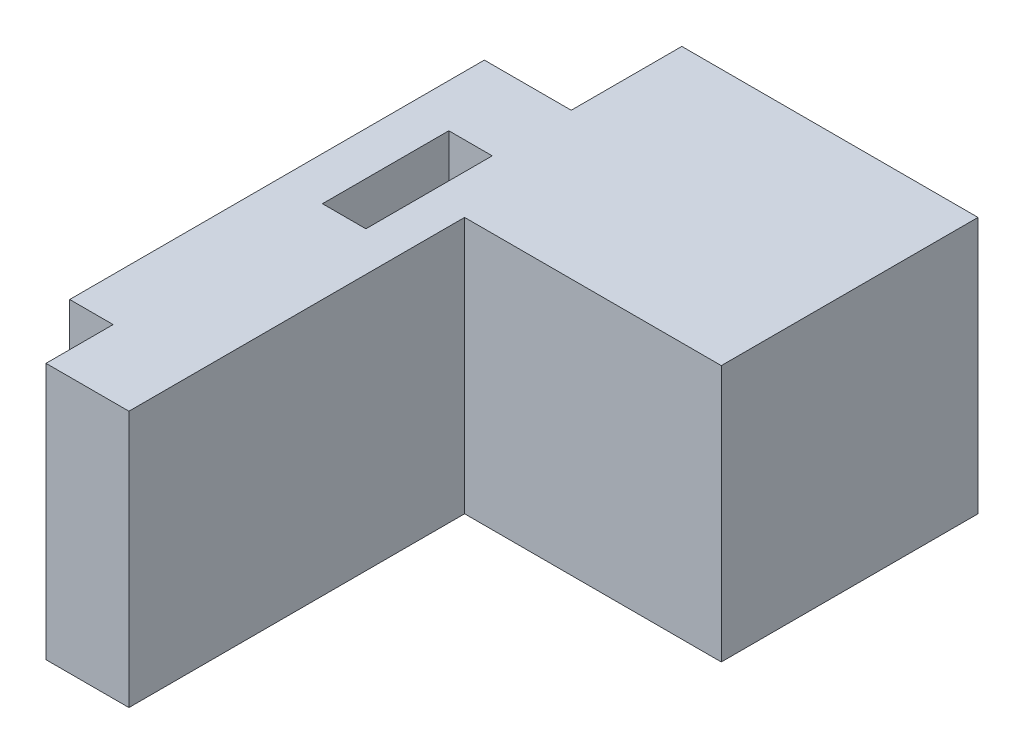
ISO-10303-21;
HEADER;
FILE_DESCRIPTION(('STEP AP214'),'2;1');
FILE_NAME('part.step','',(''),(''),'','','');
FILE_SCHEMA(('AUTOMOTIVE_DESIGN { 1 0 10303 214 1 1 1 1 }'));
ENDSEC;
DATA;
#1=APPLICATION_CONTEXT('core data for automotive mechanical design processes');
#2=APPLICATION_PROTOCOL_DEFINITION('international standard','automotive_design',2000,#1);
#3=PRODUCT_CONTEXT('',#1,'mechanical');
#4=PRODUCT('Part','Part','',(#3));
#5=PRODUCT_RELATED_PRODUCT_CATEGORY('part','',(#4));
#6=PRODUCT_DEFINITION_FORMATION('','',#4);
#7=PRODUCT_DEFINITION_CONTEXT('part definition',#1,'design');
#8=PRODUCT_DEFINITION('design','',#6,#7);
#9=PRODUCT_DEFINITION_SHAPE('','',#8);
#10=(LENGTH_UNIT() NAMED_UNIT(*) SI_UNIT(.MILLI.,.METRE.));
#11=(NAMED_UNIT(*) PLANE_ANGLE_UNIT() SI_UNIT($,.RADIAN.));
#12=(NAMED_UNIT(*) SI_UNIT($,.STERADIAN.) SOLID_ANGLE_UNIT());
#13=UNCERTAINTY_MEASURE_WITH_UNIT(LENGTH_MEASURE(1.E-05),#10,'distance_accuracy_value','');
#14=(GEOMETRIC_REPRESENTATION_CONTEXT(3) GLOBAL_UNCERTAINTY_ASSIGNED_CONTEXT((#13)) GLOBAL_UNIT_ASSIGNED_CONTEXT((#10,
#11,#12)) REPRESENTATION_CONTEXT('',''));
#15=CARTESIAN_POINT('',(0.,0.,0.));
#16=DIRECTION('',(0.,0.,1.));
#17=DIRECTION('',(1.,0.,0.));
#18=AXIS2_PLACEMENT_3D('',#15,#16,#17);
#19=CARTESIAN_POINT('',(0.,65.,32.5));
#20=DIRECTION('',(0.,0.,-1.));
#21=DIRECTION('',(-1.,0.,0.));
#22=AXIS2_PLACEMENT_3D('',#19,#20,#21);
#23=PLANE('',#22);
#24=DIRECTION('',(1.,0.,0.));
#25=VECTOR('',#24,1.);
#26=CARTESIAN_POINT('',(0.,0.,32.5));
#27=LINE('',#26,#25);
#28=CARTESIAN_POINT('',(-27.5,0.,32.5));
#29=VERTEX_POINT('',#28);
#30=CARTESIAN_POINT('',(37.5,0.,32.5));
#31=VERTEX_POINT('',#30);
#32=EDGE_CURVE('E193',#29,#31,#27,.T.);
#33=ORIENTED_EDGE('',*,*,#32,.T.);
#34=DIRECTION('',(0.,-1.,0.));
#35=VECTOR('',#34,1.);
#36=CARTESIAN_POINT('',(37.5,65.,32.5));
#37=LINE('',#36,#35);
#38=CARTESIAN_POINT('',(37.5,65.,32.5));
#39=VERTEX_POINT('',#38);
#40=EDGE_CURVE('E11',#39,#31,#37,.T.);
#41=ORIENTED_EDGE('',*,*,#40,.F.);
#42=DIRECTION('',(1.,0.,0.));
#43=VECTOR('',#42,1.);
#44=CARTESIAN_POINT('',(0.,65.,32.5));
#45=LINE('',#44,#43);
#46=CARTESIAN_POINT('',(-27.5,65.,32.5));
#47=VERTEX_POINT('',#46);
#48=EDGE_CURVE('E307',#47,#39,#45,.T.);
#49=ORIENTED_EDGE('',*,*,#48,.F.);
#50=DIRECTION('',(0.,-1.,0.));
#51=VECTOR('',#50,1.);
#52=CARTESIAN_POINT('',(-27.5,65.,32.5));
#53=LINE('',#52,#51);
#54=EDGE_CURVE('E60',#47,#29,#53,.T.);
#55=ORIENTED_EDGE('',*,*,#54,.T.);
#56=EDGE_LOOP('',(#33,#41,#49,#55));
#57=FACE_BOUND('',#56,.T.);
#58=ADVANCED_FACE('F41',(#57),#23,.F.);
#59=CARTESIAN_POINT('',(37.5,65.,0.));
#60=DIRECTION('',(-1.,0.,0.));
#61=DIRECTION('',(0.,0.,1.));
#62=AXIS2_PLACEMENT_3D('',#59,#60,#61);
#63=PLANE('',#62);
#64=DIRECTION('',(0.,0.,-1.));
#65=VECTOR('',#64,1.);
#66=CARTESIAN_POINT('',(37.5,0.,0.));
#67=LINE('',#66,#65);
#68=CARTESIAN_POINT('',(37.5,0.,-32.5));
#69=VERTEX_POINT('',#68);
#70=EDGE_CURVE('E196',#31,#69,#67,.T.);
#71=ORIENTED_EDGE('',*,*,#70,.T.);
#72=DIRECTION('',(0.,-1.,0.));
#73=VECTOR('',#72,1.);
#74=CARTESIAN_POINT('',(37.5,65.,-32.5));
#75=LINE('',#74,#73);
#76=CARTESIAN_POINT('',(37.5,65.,-32.5));
#77=VERTEX_POINT('',#76);
#78=EDGE_CURVE('E51',#77,#69,#75,.T.);
#79=ORIENTED_EDGE('',*,*,#78,.F.);
#80=DIRECTION('',(0.,0.,-1.));
#81=VECTOR('',#80,1.);
#82=CARTESIAN_POINT('',(37.5,65.,0.));
#83=LINE('',#82,#81);
#84=EDGE_CURVE('E310',#39,#77,#83,.T.);
#85=ORIENTED_EDGE('',*,*,#84,.F.);
#86=ORIENTED_EDGE('',*,*,#40,.T.);
#87=EDGE_LOOP('',(#71,#79,#85,#86));
#88=FACE_BOUND('',#87,.T.);
#89=ADVANCED_FACE('F264',(#88),#63,.F.);
#90=CARTESIAN_POINT('',(0.,65.,-32.5));
#91=DIRECTION('',(0.,0.,-1.));
#92=DIRECTION('',(-1.,0.,0.));
#93=AXIS2_PLACEMENT_3D('',#90,#91,#92);
#94=PLANE('',#93);
#95=DIRECTION('',(1.,0.,0.));
#96=VECTOR('',#95,1.);
#97=CARTESIAN_POINT('',(0.,0.,-32.5));
#98=LINE('',#97,#96);
#99=CARTESIAN_POINT('',(-37.5,0.,-32.5));
#100=VERTEX_POINT('',#99);
#101=EDGE_CURVE('E199',#100,#69,#98,.T.);
#102=ORIENTED_EDGE('',*,*,#101,.F.);
#103=DIRECTION('',(0.,-1.,0.));
#104=VECTOR('',#103,1.);
#105=CARTESIAN_POINT('',(-37.5,65.,-32.5));
#106=LINE('',#105,#104);
#107=CARTESIAN_POINT('',(-37.5,65.,-32.5));
#108=VERTEX_POINT('',#107);
#109=EDGE_CURVE('E227',#108,#100,#106,.T.);
#110=ORIENTED_EDGE('',*,*,#109,.F.);
#111=DIRECTION('',(1.,0.,0.));
#112=VECTOR('',#111,1.);
#113=CARTESIAN_POINT('',(0.,65.,-32.5));
#114=LINE('',#113,#112);
#115=EDGE_CURVE('E312',#108,#77,#114,.T.);
#116=ORIENTED_EDGE('',*,*,#115,.T.);
#117=ORIENTED_EDGE('',*,*,#78,.T.);
#118=EDGE_LOOP('',(#102,#110,#116,#117));
#119=FACE_BOUND('',#118,.T.);
#120=ADVANCED_FACE('F268',(#119),#94,.T.);
#121=CARTESIAN_POINT('',(-37.5,65.,0.));
#122=DIRECTION('',(-1.,0.,0.));
#123=DIRECTION('',(0.,0.,1.));
#124=AXIS2_PLACEMENT_3D('',#121,#122,#123);
#125=PLANE('',#124);
#126=DIRECTION('',(0.,0.,-1.));
#127=VECTOR('',#126,1.);
#128=CARTESIAN_POINT('',(-37.5,0.,0.));
#129=LINE('',#128,#127);
#130=CARTESIAN_POINT('',(-37.5,0.,-4.50000000000007));
#131=VERTEX_POINT('',#130);
#132=EDGE_CURVE('E194',#131,#100,#129,.T.);
#133=ORIENTED_EDGE('',*,*,#132,.F.);
#134=DIRECTION('',(0.,-1.,0.));
#135=VECTOR('',#134,1.);
#136=CARTESIAN_POINT('',(-37.5,65.,-4.50000000000007));
#137=LINE('',#136,#135);
#138=CARTESIAN_POINT('',(-37.5,65.,-4.50000000000007));
#139=VERTEX_POINT('',#138);
#140=EDGE_CURVE('E225',#139,#131,#137,.T.);
#141=ORIENTED_EDGE('',*,*,#140,.F.);
#142=DIRECTION('',(0.,0.,-1.));
#143=VECTOR('',#142,1.);
#144=CARTESIAN_POINT('',(-37.5,65.,0.));
#145=LINE('',#144,#143);
#146=EDGE_CURVE('E308',#139,#108,#145,.T.);
#147=ORIENTED_EDGE('',*,*,#146,.T.);
#148=ORIENTED_EDGE('',*,*,#109,.T.);
#149=EDGE_LOOP('',(#133,#141,#147,#148));
#150=FACE_BOUND('',#149,.T.);
#151=ADVANCED_FACE('F261',(#150),#125,.T.);
#152=CARTESIAN_POINT('',(0.,65.,-4.50000000000007));
#153=DIRECTION('',(0.,0.,-1.));
#154=DIRECTION('',(-1.,0.,0.));
#155=AXIS2_PLACEMENT_3D('',#152,#153,#154);
#156=PLANE('',#155);
#157=DIRECTION('',(1.,0.,0.));
#158=VECTOR('',#157,1.);
#159=CARTESIAN_POINT('',(0.,0.,-4.50000000000007));
#160=LINE('',#159,#158);
#161=CARTESIAN_POINT('',(-59.5,0.,-4.50000000000007));
#162=VERTEX_POINT('',#161);
#163=EDGE_CURVE('E202',#162,#131,#160,.T.);
#164=ORIENTED_EDGE('',*,*,#163,.F.);
#165=DIRECTION('',(0.,-1.,0.));
#166=VECTOR('',#165,1.);
#167=CARTESIAN_POINT('',(-59.5,65.,-4.50000000000007));
#168=LINE('',#167,#166);
#169=CARTESIAN_POINT('',(-59.5,65.,-4.50000000000007));
#170=VERTEX_POINT('',#169);
#171=EDGE_CURVE('E223',#170,#162,#168,.T.);
#172=ORIENTED_EDGE('',*,*,#171,.F.);
#173=DIRECTION('',(1.,0.,0.));
#174=VECTOR('',#173,1.);
#175=CARTESIAN_POINT('',(0.,65.,-4.50000000000007));
#176=LINE('',#175,#174);
#177=EDGE_CURVE('E315',#170,#139,#176,.T.);
#178=ORIENTED_EDGE('',*,*,#177,.T.);
#179=ORIENTED_EDGE('',*,*,#140,.T.);
#180=EDGE_LOOP('',(#164,#172,#178,#179));
#181=FACE_BOUND('',#180,.T.);
#182=ADVANCED_FACE('F276',(#181),#156,.T.);
#183=CARTESIAN_POINT('',(-59.5,65.,0.));
#184=DIRECTION('',(-1.,0.,0.));
#185=DIRECTION('',(0.,0.,1.));
#186=AXIS2_PLACEMENT_3D('',#183,#184,#185);
#187=PLANE('',#186);
#188=DIRECTION('',(0.,0.,-1.));
#189=VECTOR('',#188,1.);
#190=CARTESIAN_POINT('',(-59.5,0.,0.));
#191=LINE('',#190,#189);
#192=CARTESIAN_POINT('',(-59.5,0.,100.5));
#193=VERTEX_POINT('',#192);
#194=EDGE_CURVE('E205',#193,#162,#191,.T.);
#195=ORIENTED_EDGE('',*,*,#194,.F.);
#196=DIRECTION('',(0.,-1.,0.));
#197=VECTOR('',#196,1.);
#198=CARTESIAN_POINT('',(-59.5,65.,100.5));
#199=LINE('',#198,#197);
#200=CARTESIAN_POINT('',(-59.5,65.,100.5));
#201=VERTEX_POINT('',#200);
#202=EDGE_CURVE('E221',#201,#193,#199,.T.);
#203=ORIENTED_EDGE('',*,*,#202,.F.);
#204=DIRECTION('',(0.,0.,-1.));
#205=VECTOR('',#204,1.);
#206=CARTESIAN_POINT('',(-59.5,65.,0.));
#207=LINE('',#206,#205);
#208=EDGE_CURVE('E176',#201,#170,#207,.T.);
#209=ORIENTED_EDGE('',*,*,#208,.T.);
#210=ORIENTED_EDGE('',*,*,#171,.T.);
#211=EDGE_LOOP('',(#195,#203,#209,#210));
#212=FACE_BOUND('',#211,.T.);
#213=ADVANCED_FACE('F280',(#212),#187,.T.);
#214=CARTESIAN_POINT('',(0.,65.,100.5));
#215=DIRECTION('',(0.,0.,1.));
#216=DIRECTION('',(1.,0.,0.));
#217=AXIS2_PLACEMENT_3D('',#214,#215,#216);
#218=PLANE('',#217);
#219=DIRECTION('',(-1.,0.,0.));
#220=VECTOR('',#219,1.);
#221=CARTESIAN_POINT('',(0.,0.,100.5));
#222=LINE('',#221,#220);
#223=CARTESIAN_POINT('',(-48.5,0.,100.5));
#224=VERTEX_POINT('',#223);
#225=EDGE_CURVE('E208',#224,#193,#222,.T.);
#226=ORIENTED_EDGE('',*,*,#225,.F.);
#227=DIRECTION('',(0.,-1.,0.));
#228=VECTOR('',#227,1.);
#229=CARTESIAN_POINT('',(-48.5,65.,100.5));
#230=LINE('',#229,#228);
#231=CARTESIAN_POINT('',(-48.5,65.,100.5));
#232=VERTEX_POINT('',#231);
#233=EDGE_CURVE('E161',#232,#224,#230,.T.);
#234=ORIENTED_EDGE('',*,*,#233,.F.);
#235=DIRECTION('',(-1.,0.,0.));
#236=VECTOR('',#235,1.);
#237=CARTESIAN_POINT('',(0.,65.,100.5));
#238=LINE('',#237,#236);
#239=EDGE_CURVE('E174',#232,#201,#238,.T.);
#240=ORIENTED_EDGE('',*,*,#239,.T.);
#241=ORIENTED_EDGE('',*,*,#202,.T.);
#242=EDGE_LOOP('',(#226,#234,#240,#241));
#243=FACE_BOUND('',#242,.T.);
#244=ADVANCED_FACE('F284',(#243),#218,.T.);
#245=CARTESIAN_POINT('',(-48.5,65.,0.));
#246=DIRECTION('',(-1.,0.,0.));
#247=DIRECTION('',(0.,0.,1.));
#248=AXIS2_PLACEMENT_3D('',#245,#246,#247);
#249=PLANE('',#248);
#250=DIRECTION('',(0.,0.,-1.));
#251=VECTOR('',#250,1.);
#252=CARTESIAN_POINT('',(-48.5,0.,0.));
#253=LINE('',#252,#251);
#254=CARTESIAN_POINT('',(-48.5,0.,117.5));
#255=VERTEX_POINT('',#254);
#256=EDGE_CURVE('E158',#255,#224,#253,.T.);
#257=ORIENTED_EDGE('',*,*,#256,.F.);
#258=DIRECTION('',(0.,-1.,0.));
#259=VECTOR('',#258,1.);
#260=CARTESIAN_POINT('',(-48.5,65.,117.5));
#261=LINE('',#260,#259);
#262=CARTESIAN_POINT('',(-48.5,65.,117.5));
#263=VERTEX_POINT('',#262);
#264=EDGE_CURVE('E152',#263,#255,#261,.T.);
#265=ORIENTED_EDGE('',*,*,#264,.F.);
#266=DIRECTION('',(0.,0.,-1.));
#267=VECTOR('',#266,1.);
#268=CARTESIAN_POINT('',(-48.5,65.,0.));
#269=LINE('',#268,#267);
#270=EDGE_CURVE('E156',#263,#232,#269,.T.);
#271=ORIENTED_EDGE('',*,*,#270,.T.);
#272=ORIENTED_EDGE('',*,*,#233,.T.);
#273=EDGE_LOOP('',(#257,#265,#271,#272));
#274=FACE_BOUND('',#273,.T.);
#275=ADVANCED_FACE('F154',(#274),#249,.T.);
#276=CARTESIAN_POINT('',(-3.2612801348364E-13,65.,117.5));
#277=DIRECTION('',(0.,0.,-1.));
#278=DIRECTION('',(-1.,0.,0.));
#279=AXIS2_PLACEMENT_3D('',#276,#277,#278);
#280=PLANE('',#279);
#281=DIRECTION('',(1.,0.,0.));
#282=VECTOR('',#281,1.);
#283=CARTESIAN_POINT('',(-3.2612801348364E-13,0.,117.5));
#284=LINE('',#283,#282);
#285=CARTESIAN_POINT('',(-27.5,0.,117.5));
#286=VERTEX_POINT('',#285);
#287=EDGE_CURVE('E212',#255,#286,#284,.T.);
#288=ORIENTED_EDGE('',*,*,#287,.T.);
#289=DIRECTION('',(0.,-1.,0.));
#290=VECTOR('',#289,1.);
#291=CARTESIAN_POINT('',(-27.5,65.,117.5));
#292=LINE('',#291,#290);
#293=CARTESIAN_POINT('',(-27.5,65.,117.5));
#294=VERTEX_POINT('',#293);
#295=EDGE_CURVE('E105',#294,#286,#292,.T.);
#296=ORIENTED_EDGE('',*,*,#295,.F.);
#297=DIRECTION('',(1.,0.,0.));
#298=VECTOR('',#297,1.);
#299=CARTESIAN_POINT('',(-3.2612801348364E-13,65.,117.5));
#300=LINE('',#299,#298);
#301=EDGE_CURVE('E163',#263,#294,#300,.T.);
#302=ORIENTED_EDGE('',*,*,#301,.F.);
#303=ORIENTED_EDGE('',*,*,#264,.T.);
#304=EDGE_LOOP('',(#288,#296,#302,#303));
#305=FACE_BOUND('',#304,.T.);
#306=ADVANCED_FACE('F164',(#305),#280,.F.);
#307=CARTESIAN_POINT('',(0.,65.,47.5));
#308=DIRECTION('',(0.,0.,1.));
#309=DIRECTION('',(1.,0.,0.));
#310=AXIS2_PLACEMENT_3D('',#307,#308,#309);
#311=PLANE('',#310);
#312=DIRECTION('',(-1.,0.,0.));
#313=VECTOR('',#312,1.);
#314=CARTESIAN_POINT('',(0.,0.,47.5));
#315=LINE('',#314,#313);
#316=CARTESIAN_POINT('',(-37.5,0.,47.5));
#317=VERTEX_POINT('',#316);
#318=CARTESIAN_POINT('',(-48.5,0.,47.5));
#319=VERTEX_POINT('',#318);
#320=EDGE_CURVE('E182',#317,#319,#315,.T.);
#321=ORIENTED_EDGE('',*,*,#320,.T.);
#322=DIRECTION('',(0.,-1.,0.));
#323=VECTOR('',#322,1.);
#324=CARTESIAN_POINT('',(-48.5,65.,47.5));
#325=LINE('',#324,#323);
#326=CARTESIAN_POINT('',(-48.5,65.,47.5));
#327=VERTEX_POINT('',#326);
#328=EDGE_CURVE('E45',#327,#319,#325,.T.);
#329=ORIENTED_EDGE('',*,*,#328,.F.);
#330=DIRECTION('',(-1.,0.,0.));
#331=VECTOR('',#330,1.);
#332=CARTESIAN_POINT('',(0.,65.,47.5));
#333=LINE('',#332,#331);
#334=CARTESIAN_POINT('',(-37.5,65.,47.5));
#335=VERTEX_POINT('',#334);
#336=EDGE_CURVE('E217',#335,#327,#333,.T.);
#337=ORIENTED_EDGE('',*,*,#336,.F.);
#338=DIRECTION('',(0.,-1.,0.));
#339=VECTOR('',#338,1.);
#340=CARTESIAN_POINT('',(-37.5,65.,47.5));
#341=LINE('',#340,#339);
#342=EDGE_CURVE('E181',#335,#317,#341,.T.);
#343=ORIENTED_EDGE('',*,*,#342,.T.);
#344=EDGE_LOOP('',(#321,#329,#337,#343));
#345=FACE_BOUND('',#344,.T.);
#346=ADVANCED_FACE('F43',(#345),#311,.F.);
#347=CARTESIAN_POINT('',(-48.5,65.,0.));
#348=DIRECTION('',(-1.,0.,0.));
#349=DIRECTION('',(0.,0.,1.));
#350=AXIS2_PLACEMENT_3D('',#347,#348,#349);
#351=PLANE('',#350);
#352=DIRECTION('',(0.,0.,-1.));
#353=VECTOR('',#352,1.);
#354=CARTESIAN_POINT('',(-48.5,0.,0.));
#355=LINE('',#354,#353);
#356=CARTESIAN_POINT('',(-48.5,0.,15.4999999999999));
#357=VERTEX_POINT('',#356);
#358=EDGE_CURVE('E185',#319,#357,#355,.T.);
#359=ORIENTED_EDGE('',*,*,#358,.T.);
#360=DIRECTION('',(0.,-1.,0.));
#361=VECTOR('',#360,1.);
#362=CARTESIAN_POINT('',(-48.5,65.,15.4999999999999));
#363=LINE('',#362,#361);
#364=CARTESIAN_POINT('',(-48.5,65.,15.4999999999999));
#365=VERTEX_POINT('',#364);
#366=EDGE_CURVE('E232',#365,#357,#363,.T.);
#367=ORIENTED_EDGE('',*,*,#366,.F.);
#368=DIRECTION('',(0.,0.,-1.));
#369=VECTOR('',#368,1.);
#370=CARTESIAN_POINT('',(-48.5,65.,0.));
#371=LINE('',#370,#369);
#372=EDGE_CURVE('E118',#327,#365,#371,.T.);
#373=ORIENTED_EDGE('',*,*,#372,.F.);
#374=ORIENTED_EDGE('',*,*,#328,.T.);
#375=EDGE_LOOP('',(#359,#367,#373,#374));
#376=FACE_BOUND('',#375,.T.);
#377=ADVANCED_FACE('F238',(#376),#351,.F.);
#378=CARTESIAN_POINT('',(0.,65.,15.4999999999999));
#379=DIRECTION('',(0.,0.,-1.));
#380=DIRECTION('',(-1.,0.,0.));
#381=AXIS2_PLACEMENT_3D('',#378,#379,#380);
#382=PLANE('',#381);
#383=DIRECTION('',(1.,0.,0.));
#384=VECTOR('',#383,1.);
#385=CARTESIAN_POINT('',(0.,0.,15.4999999999999));
#386=LINE('',#385,#384);
#387=CARTESIAN_POINT('',(-37.5,0.,15.4999999999999));
#388=VERTEX_POINT('',#387);
#389=EDGE_CURVE('E187',#357,#388,#386,.T.);
#390=ORIENTED_EDGE('',*,*,#389,.T.);
#391=DIRECTION('',(0.,-1.,0.));
#392=VECTOR('',#391,1.);
#393=CARTESIAN_POINT('',(-37.5,65.,15.4999999999999));
#394=LINE('',#393,#392);
#395=CARTESIAN_POINT('',(-37.5,65.,15.4999999999999));
#396=VERTEX_POINT('',#395);
#397=EDGE_CURVE('E231',#396,#388,#394,.T.);
#398=ORIENTED_EDGE('',*,*,#397,.F.);
#399=DIRECTION('',(1.,0.,0.));
#400=VECTOR('',#399,1.);
#401=CARTESIAN_POINT('',(0.,65.,15.4999999999999));
#402=LINE('',#401,#400);
#403=EDGE_CURVE('E302',#365,#396,#402,.T.);
#404=ORIENTED_EDGE('',*,*,#403,.F.);
#405=ORIENTED_EDGE('',*,*,#366,.T.);
#406=EDGE_LOOP('',(#390,#398,#404,#405));
#407=FACE_BOUND('',#406,.T.);
#408=ADVANCED_FACE('F252',(#407),#382,.F.);
#409=EDGE_CURVE('E190',#317,#388,#129,.T.);
#410=ORIENTED_EDGE('',*,*,#409,.F.);
#411=ORIENTED_EDGE('',*,*,#342,.F.);
#412=EDGE_CURVE('E251',#335,#396,#145,.T.);
#413=ORIENTED_EDGE('',*,*,#412,.T.);
#414=ORIENTED_EDGE('',*,*,#397,.T.);
#415=EDGE_LOOP('',(#410,#411,#413,#414));
#416=FACE_BOUND('',#415,.T.);
#417=ADVANCED_FACE('F247',(#416),#125,.T.);
#418=CARTESIAN_POINT('',(-27.5,65.,0.));
#419=DIRECTION('',(1.,0.,0.));
#420=DIRECTION('',(0.,0.,-1.));
#421=AXIS2_PLACEMENT_3D('',#418,#419,#420);
#422=PLANE('',#421);
#423=DIRECTION('',(0.,0.,1.));
#424=VECTOR('',#423,1.);
#425=CARTESIAN_POINT('',(-27.5,0.,0.));
#426=LINE('',#425,#424);
#427=EDGE_CURVE('E214',#29,#286,#426,.T.);
#428=ORIENTED_EDGE('',*,*,#427,.F.);
#429=ORIENTED_EDGE('',*,*,#54,.F.);
#430=DIRECTION('',(0.,0.,1.));
#431=VECTOR('',#430,1.);
#432=CARTESIAN_POINT('',(-27.5,65.,0.));
#433=LINE('',#432,#431);
#434=EDGE_CURVE('E167',#47,#294,#433,.T.);
#435=ORIENTED_EDGE('',*,*,#434,.T.);
#436=ORIENTED_EDGE('',*,*,#295,.T.);
#437=EDGE_LOOP('',(#428,#429,#435,#436));
#438=FACE_BOUND('',#437,.T.);
#439=ADVANCED_FACE('F259',(#438),#422,.T.);
#440=CARTESIAN_POINT('',(0.,65.,0.));
#441=DIRECTION('',(0.,1.,0.));
#442=DIRECTION('',(0.,0.,1.));
#443=AXIS2_PLACEMENT_3D('',#440,#441,#442);
#444=PLANE('',#443);
#445=ORIENTED_EDGE('',*,*,#336,.T.);
#446=ORIENTED_EDGE('',*,*,#372,.T.);
#447=ORIENTED_EDGE('',*,*,#403,.T.);
#448=ORIENTED_EDGE('',*,*,#412,.F.);
#449=EDGE_LOOP('',(#445,#446,#447,#448));
#450=FACE_BOUND('',#449,.T.);
#451=ORIENTED_EDGE('',*,*,#48,.T.);
#452=ORIENTED_EDGE('',*,*,#84,.T.);
#453=ORIENTED_EDGE('',*,*,#115,.F.);
#454=ORIENTED_EDGE('',*,*,#146,.F.);
#455=ORIENTED_EDGE('',*,*,#177,.F.);
#456=ORIENTED_EDGE('',*,*,#208,.F.);
#457=ORIENTED_EDGE('',*,*,#239,.F.);
#458=ORIENTED_EDGE('',*,*,#270,.F.);
#459=ORIENTED_EDGE('',*,*,#301,.T.);
#460=ORIENTED_EDGE('',*,*,#434,.F.);
#461=EDGE_LOOP('',(#451,#452,#453,#454,#455,#456,#457,#458,#459,#460));
#462=FACE_BOUND('',#461,.T.);
#463=ADVANCED_FACE('F171',(#450,#462),#444,.T.);
#464=CARTESIAN_POINT('',(0.,0.,0.));
#465=DIRECTION('',(0.,1.,0.));
#466=DIRECTION('',(0.,0.,1.));
#467=AXIS2_PLACEMENT_3D('',#464,#465,#466);
#468=PLANE('',#467);
#469=ORIENTED_EDGE('',*,*,#320,.F.);
#470=ORIENTED_EDGE('',*,*,#409,.T.);
#471=ORIENTED_EDGE('',*,*,#389,.F.);
#472=ORIENTED_EDGE('',*,*,#358,.F.);
#473=EDGE_LOOP('',(#469,#470,#471,#472));
#474=FACE_BOUND('',#473,.T.);
#475=ORIENTED_EDGE('',*,*,#32,.F.);
#476=ORIENTED_EDGE('',*,*,#427,.T.);
#477=ORIENTED_EDGE('',*,*,#287,.F.);
#478=ORIENTED_EDGE('',*,*,#256,.T.);
#479=ORIENTED_EDGE('',*,*,#225,.T.);
#480=ORIENTED_EDGE('',*,*,#194,.T.);
#481=ORIENTED_EDGE('',*,*,#163,.T.);
#482=ORIENTED_EDGE('',*,*,#132,.T.);
#483=ORIENTED_EDGE('',*,*,#101,.T.);
#484=ORIENTED_EDGE('',*,*,#70,.F.);
#485=EDGE_LOOP('',(#475,#476,#477,#478,#479,#480,#481,#482,#483,#484));
#486=FACE_BOUND('',#485,.T.);
#487=ADVANCED_FACE('F244',(#474,#486),#468,.F.);
#488=CLOSED_SHELL('',(#58,#89,#120,#151,#182,#213,#244,#275,#306,#346,#377,#408,#417,#439,#463,#487));
#489=MANIFOLD_SOLID_BREP('B2',#488);
#490=ADVANCED_BREP_SHAPE_REPRESENTATION('',(#18,#489),#14);
#491=SHAPE_DEFINITION_REPRESENTATION(#9,#490);
ENDSEC;
END-ISO-10303-21;
